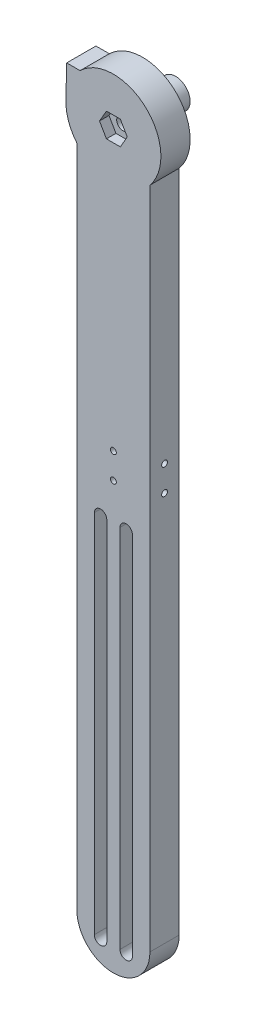
ISO-10303-21;
HEADER;
FILE_DESCRIPTION(('STEP AP214'),'2;1');
FILE_NAME('part.step','',(''),(''),'','','');
FILE_SCHEMA(('AUTOMOTIVE_DESIGN { 1 0 10303 214 1 1 1 1 }'));
ENDSEC;
DATA;
#1=APPLICATION_CONTEXT('core data for automotive mechanical design processes');
#2=APPLICATION_PROTOCOL_DEFINITION('international standard','automotive_design',2000,#1);
#3=PRODUCT_CONTEXT('',#1,'mechanical');
#4=PRODUCT('Part','Part','',(#3));
#5=PRODUCT_RELATED_PRODUCT_CATEGORY('part','',(#4));
#6=PRODUCT_DEFINITION_FORMATION('','',#4);
#7=PRODUCT_DEFINITION_CONTEXT('part definition',#1,'design');
#8=PRODUCT_DEFINITION('design','',#6,#7);
#9=PRODUCT_DEFINITION_SHAPE('','',#8);
#10=(LENGTH_UNIT() NAMED_UNIT(*) SI_UNIT(.MILLI.,.METRE.));
#11=(NAMED_UNIT(*) PLANE_ANGLE_UNIT() SI_UNIT($,.RADIAN.));
#12=(NAMED_UNIT(*) SI_UNIT($,.STERADIAN.) SOLID_ANGLE_UNIT());
#13=UNCERTAINTY_MEASURE_WITH_UNIT(LENGTH_MEASURE(1.E-05),#10,'distance_accuracy_value','');
#14=(GEOMETRIC_REPRESENTATION_CONTEXT(3) GLOBAL_UNCERTAINTY_ASSIGNED_CONTEXT((#13)) GLOBAL_UNIT_ASSIGNED_CONTEXT((#10,
#11,#12)) REPRESENTATION_CONTEXT('',''));
#15=CARTESIAN_POINT('',(0.,0.,0.));
#16=DIRECTION('',(0.,0.,1.));
#17=DIRECTION('',(1.,0.,0.));
#18=AXIS2_PLACEMENT_3D('',#15,#16,#17);
#19=CARTESIAN_POINT('',(0.,-99.9999999999999,8.));
#20=DIRECTION('',(0.,0.,-1.));
#21=DIRECTION('',(1.,0.,0.));
#22=AXIS2_PLACEMENT_3D('',#19,#20,#21);
#23=CYLINDRICAL_SURFACE('',#22,13.);
#24=CARTESIAN_POINT('',(0.,-99.9999999999999,0.));
#25=DIRECTION('',(0.,0.,-1.));
#26=DIRECTION('',(1.,0.,0.));
#27=AXIS2_PLACEMENT_3D('',#24,#25,#26);
#28=CIRCLE('',#27,13.);
#29=CARTESIAN_POINT('',(-9.11004153380745,-90.7259963741486,0.));
#30=VERTEX_POINT('',#29);
#31=CARTESIAN_POINT('',(10.0000000000001,-108.306623862918,0.));
#32=VERTEX_POINT('',#31);
#33=EDGE_CURVE('E528',#30,#32,#28,.T.);
#34=ORIENTED_EDGE('',*,*,#33,.F.);
#35=DIRECTION('',(0.,0.,-1.));
#36=VECTOR('',#35,1.);
#37=CARTESIAN_POINT('',(-9.11004153380744,-90.7259963741486,7.99999999999998));
#38=LINE('',#37,#36);
#39=CARTESIAN_POINT('',(-9.11004153380743,-90.7259963741486,8.));
#40=VERTEX_POINT('',#39);
#41=EDGE_CURVE('E235',#30,#40,#38,.F.);
#42=ORIENTED_EDGE('',*,*,#41,.T.);
#43=CARTESIAN_POINT('',(0.,-99.9999999999999,8.));
#44=DIRECTION('',(0.,0.,-1.));
#45=DIRECTION('',(1.,0.,0.));
#46=AXIS2_PLACEMENT_3D('',#43,#44,#45);
#47=CIRCLE('',#46,13.);
#48=CARTESIAN_POINT('',(10.0000000000001,-108.306623862918,8.));
#49=VERTEX_POINT('',#48);
#50=EDGE_CURVE('E533',#40,#49,#47,.T.);
#51=ORIENTED_EDGE('',*,*,#50,.T.);
#52=DIRECTION('',(0.,0.,-1.));
#53=VECTOR('',#52,1.);
#54=CARTESIAN_POINT('',(10.0000000000001,-108.306623862918,8.));
#55=LINE('',#54,#53);
#56=EDGE_CURVE('E499',#49,#32,#55,.T.);
#57=ORIENTED_EDGE('',*,*,#56,.T.);
#58=EDGE_LOOP('',(#34,#42,#51,#57));
#59=FACE_BOUND('',#58,.T.);
#60=ADVANCED_FACE('F54',(#59),#23,.T.);
#61=CARTESIAN_POINT('',(-9.99999999999992,-108.306623862918,8.));
#62=VERTEX_POINT('',#61);
#63=CARTESIAN_POINT('',(-12.9909985797308,-99.5163101185333,8.00000000000001));
#64=VERTEX_POINT('',#63);
#65=EDGE_CURVE('E527',#62,#64,#47,.T.);
#66=ORIENTED_EDGE('',*,*,#65,.T.);
#67=DIRECTION('',(0.,0.,-1.));
#68=VECTOR('',#67,1.);
#69=CARTESIAN_POINT('',(-12.9909985797307,-99.5163101185333,8.));
#70=LINE('',#69,#68);
#71=CARTESIAN_POINT('',(-12.9909985797307,-99.5163101185333,0.));
#72=VERTEX_POINT('',#71);
#73=EDGE_CURVE('E269',#64,#72,#70,.T.);
#74=ORIENTED_EDGE('',*,*,#73,.T.);
#75=CARTESIAN_POINT('',(-9.99999999999992,-108.306623862918,0.));
#76=VERTEX_POINT('',#75);
#77=EDGE_CURVE('E535',#76,#72,#28,.T.);
#78=ORIENTED_EDGE('',*,*,#77,.F.);
#79=DIRECTION('',(0.,0.,-1.));
#80=VECTOR('',#79,1.);
#81=CARTESIAN_POINT('',(-9.99999999999992,-108.306623862918,8.));
#82=LINE('',#81,#80);
#83=EDGE_CURVE('E510',#76,#62,#82,.F.);
#84=ORIENTED_EDGE('',*,*,#83,.T.);
#85=EDGE_LOOP('',(#66,#74,#78,#84));
#86=FACE_BOUND('',#85,.T.);
#87=ADVANCED_FACE('F554',(#86),#23,.T.);
#88=CARTESIAN_POINT('',(0.,-99.9999999999999,-13.));
#89=DIRECTION('',(0.,0.,-1.));
#90=DIRECTION('',(1.,0.,0.));
#91=AXIS2_PLACEMENT_3D('',#88,#89,#90);
#92=CYLINDRICAL_SURFACE('',#91,1.69999999999999);
#93=CARTESIAN_POINT('',(0.,-99.9999999999999,-9.));
#94=DIRECTION('',(0.,0.,1.));
#95=DIRECTION('',(-1.,0.,0.));
#96=AXIS2_PLACEMENT_3D('',#93,#94,#95);
#97=CIRCLE('',#96,1.69999999999999);
#98=CARTESIAN_POINT('',(-1.69999999999996,-99.9999999999999,-9.));
#99=VERTEX_POINT('',#98);
#100=EDGE_CURVE('E519',#99,#99,#97,.T.);
#101=ORIENTED_EDGE('',*,*,#100,.F.);
#102=EDGE_LOOP('',(#101));
#103=FACE_BOUND('',#102,.T.);
#104=CARTESIAN_POINT('',(0.,-99.9999999999999,5.4));
#105=DIRECTION('',(0.,0.,1.));
#106=DIRECTION('',(-1.,0.,0.));
#107=AXIS2_PLACEMENT_3D('',#104,#105,#106);
#108=CIRCLE('',#107,1.69999999999999);
#109=CARTESIAN_POINT('',(-1.69999999999996,-99.9999999999999,5.4));
#110=VERTEX_POINT('',#109);
#111=EDGE_CURVE('E56',#110,#110,#108,.F.);
#112=ORIENTED_EDGE('',*,*,#111,.F.);
#113=EDGE_LOOP('',(#112));
#114=FACE_BOUND('',#113,.T.);
#115=ADVANCED_FACE('F549',(#103,#114),#92,.F.);
#116=CARTESIAN_POINT('',(0.,-99.9999999999999,0.));
#117=DIRECTION('',(0.,0.,-1.));
#118=DIRECTION('',(1.,0.,0.));
#119=AXIS2_PLACEMENT_3D('',#116,#117,#118);
#120=CYLINDRICAL_SURFACE('',#119,4.00000000000001);
#121=CARTESIAN_POINT('',(0.,-99.9999999999999,-9.));
#122=DIRECTION('',(0.,0.,1.));
#123=DIRECTION('',(-1.,0.,0.));
#124=AXIS2_PLACEMENT_3D('',#121,#122,#123);
#125=CIRCLE('',#124,4.00000000000001);
#126=CARTESIAN_POINT('',(-3.99999999999998,-99.9999999999999,-9.));
#127=VERTEX_POINT('',#126);
#128=EDGE_CURVE('E63',#127,#127,#125,.T.);
#129=ORIENTED_EDGE('',*,*,#128,.T.);
#130=EDGE_LOOP('',(#129));
#131=FACE_BOUND('',#130,.T.);
#132=CARTESIAN_POINT('',(0.,-99.9999999999999,-2.));
#133=DIRECTION('',(0.,0.,1.));
#134=DIRECTION('',(-1.,0.,0.));
#135=AXIS2_PLACEMENT_3D('',#132,#133,#134);
#136=CIRCLE('',#135,4.00000000000001);
#137=CARTESIAN_POINT('',(-3.99999999999998,-99.9999999999999,-2.));
#138=VERTEX_POINT('',#137);
#139=EDGE_CURVE('E11',#138,#138,#136,.T.);
#140=ORIENTED_EDGE('',*,*,#139,.F.);
#141=EDGE_LOOP('',(#140));
#142=FACE_BOUND('',#141,.T.);
#143=ADVANCED_FACE('F60',(#131,#142),#120,.T.);
#144=CARTESIAN_POINT('',(0.,-99.9999999999999,-9.));
#145=DIRECTION('',(0.,0.,1.));
#146=DIRECTION('',(-1.,0.,0.));
#147=AXIS2_PLACEMENT_3D('',#144,#145,#146);
#148=PLANE('',#147);
#149=ORIENTED_EDGE('',*,*,#100,.T.);
#150=EDGE_LOOP('',(#149));
#151=FACE_BOUND('',#150,.T.);
#152=ORIENTED_EDGE('',*,*,#128,.F.);
#153=EDGE_LOOP('',(#152));
#154=FACE_BOUND('',#153,.T.);
#155=ADVANCED_FACE('F541',(#151,#154),#148,.F.);
#156=CARTESIAN_POINT('',(0.,-99.9999999999999,8.));
#157=DIRECTION('',(0.,0.,-1.));
#158=DIRECTION('',(1.,0.,0.));
#159=AXIS2_PLACEMENT_3D('',#156,#157,#158);
#160=PLANE('',#159);
#161=ORIENTED_EDGE('',*,*,#50,.F.);
#162=DIRECTION('',(-1.,0.,0.));
#163=VECTOR('',#162,1.);
#164=CARTESIAN_POINT('',(13.002,-90.7259963741484,8.00000000000001));
#165=LINE('',#164,#163);
#166=CARTESIAN_POINT('',(-12.7746204756805,-90.7259963741486,8.));
#167=VERTEX_POINT('',#166);
#168=EDGE_CURVE('E237',#40,#167,#165,.T.);
#169=ORIENTED_EDGE('',*,*,#168,.T.);
#170=DIRECTION('',(0.0247233375920062,0.999694331572562,0.));
#171=VECTOR('',#170,1.);
#172=CARTESIAN_POINT('',(-12.7819530757289,-91.022491888832,8.));
#173=LINE('',#172,#171);
#174=CARTESIAN_POINT('',(-12.9920128198986,-99.5163101185333,8.00000000000001));
#175=VERTEX_POINT('',#174);
#176=EDGE_CURVE('E248',#175,#167,#173,.T.);
#177=ORIENTED_EDGE('',*,*,#176,.F.);
#178=DIRECTION('',(1.,0.,0.));
#179=VECTOR('',#178,1.);
#180=CARTESIAN_POINT('',(-24.77082327833,-99.5163101185334,8.00000000000001));
#181=LINE('',#180,#179);
#182=EDGE_CURVE('E250',#175,#64,#181,.T.);
#183=ORIENTED_EDGE('',*,*,#182,.T.);
#184=ORIENTED_EDGE('',*,*,#65,.F.);
#185=DIRECTION('',(0.,-1.,0.));
#186=VECTOR('',#185,1.);
#187=CARTESIAN_POINT('',(-10.0000000000001,-86.9979999999999,8.));
#188=LINE('',#187,#186);
#189=CARTESIAN_POINT('',(-9.99999999999867,-290.,8.));
#190=VERTEX_POINT('',#189);
#191=EDGE_CURVE('E508',#62,#190,#188,.T.);
#192=ORIENTED_EDGE('',*,*,#191,.T.);
#193=CARTESIAN_POINT('',(1.32879818259823E-12,-290.,8.));
#194=DIRECTION('',(0.,0.,1.));
#195=DIRECTION('',(-1.,0.,0.));
#196=AXIS2_PLACEMENT_3D('',#193,#194,#195);
#197=CIRCLE('',#196,10.);
#198=CARTESIAN_POINT('',(1.24553145575135E-12,-300.,8.));
#199=VERTEX_POINT('',#198);
#200=EDGE_CURVE('E482',#190,#199,#197,.T.);
#201=ORIENTED_EDGE('',*,*,#200,.T.);
#202=CARTESIAN_POINT('',(1.31492039479042E-12,-290.,8.));
#203=DIRECTION('',(0.,0.,1.));
#204=DIRECTION('',(-1.,0.,0.));
#205=AXIS2_PLACEMENT_3D('',#202,#203,#204);
#206=CIRCLE('',#205,10.);
#207=CARTESIAN_POINT('',(10.0000000000013,-290.,8.));
#208=VERTEX_POINT('',#207);
#209=EDGE_CURVE('E484',#199,#208,#206,.T.);
#210=ORIENTED_EDGE('',*,*,#209,.T.);
#211=DIRECTION('',(0.,-1.,0.));
#212=VECTOR('',#211,1.);
#213=CARTESIAN_POINT('',(9.99999999999994,-86.9979999999998,8.));
#214=LINE('',#213,#212);
#215=EDGE_CURVE('E497',#49,#208,#214,.T.);
#216=ORIENTED_EDGE('',*,*,#215,.F.);
#217=EDGE_LOOP('',(#161,#169,#177,#183,#184,#192,#201,#210,#216));
#218=FACE_BOUND('',#217,.T.);
#219=CARTESIAN_POINT('',(3.50000000000138,-293.5,8.));
#220=DIRECTION('',(0.,0.,1.));
#221=DIRECTION('',(-1.,0.,0.));
#222=AXIS2_PLACEMENT_3D('',#219,#220,#221);
#223=CIRCLE('',#222,1.70000000000003);
#224=CARTESIAN_POINT('',(1.80000000000134,-293.5,8.));
#225=VERTEX_POINT('',#224);
#226=CARTESIAN_POINT('',(5.20000000000141,-293.5,8.));
#227=VERTEX_POINT('',#226);
#228=EDGE_CURVE('E401',#225,#227,#223,.T.);
#229=ORIENTED_EDGE('',*,*,#228,.F.);
#230=DIRECTION('',(0.,-1.,0.));
#231=VECTOR('',#230,1.);
#232=CARTESIAN_POINT('',(1.8000000000007,-200.,8.));
#233=LINE('',#232,#231);
#234=CARTESIAN_POINT('',(1.80000000000065,-193.5,8.));
#235=VERTEX_POINT('',#234);
#236=EDGE_CURVE('E404',#235,#225,#233,.T.);
#237=ORIENTED_EDGE('',*,*,#236,.F.);
#238=CARTESIAN_POINT('',(3.50000000000067,-193.5,8.));
#239=DIRECTION('',(0.,0.,1.));
#240=DIRECTION('',(-1.,0.,0.));
#241=AXIS2_PLACEMENT_3D('',#238,#239,#240);
#242=CIRCLE('',#241,1.70000000000002);
#243=CARTESIAN_POINT('',(5.2000000000007,-193.5,8.));
#244=VERTEX_POINT('',#243);
#245=EDGE_CURVE('E407',#244,#235,#242,.T.);
#246=ORIENTED_EDGE('',*,*,#245,.F.);
#247=DIRECTION('',(0.,-1.,0.));
#248=VECTOR('',#247,1.);
#249=CARTESIAN_POINT('',(5.20000000000074,-200.,8.));
#250=LINE('',#249,#248);
#251=EDGE_CURVE('E412',#244,#227,#250,.T.);
#252=ORIENTED_EDGE('',*,*,#251,.T.);
#253=EDGE_LOOP('',(#229,#237,#246,#252));
#254=FACE_BOUND('',#253,.T.);
#255=CARTESIAN_POINT('',(-3.49999999999863,-293.5,8.));
#256=DIRECTION('',(0.,0.,1.));
#257=DIRECTION('',(-1.,0.,0.));
#258=AXIS2_PLACEMENT_3D('',#255,#256,#257);
#259=CIRCLE('',#258,1.70000000000004);
#260=CARTESIAN_POINT('',(-5.19999999999867,-293.5,8.));
#261=VERTEX_POINT('',#260);
#262=CARTESIAN_POINT('',(-1.79999999999861,-293.5,8.));
#263=VERTEX_POINT('',#262);
#264=EDGE_CURVE('E383',#261,#263,#259,.T.);
#265=ORIENTED_EDGE('',*,*,#264,.F.);
#266=DIRECTION('',(0.,-1.,0.));
#267=VECTOR('',#266,1.);
#268=CARTESIAN_POINT('',(-5.19999999999931,-200.,8.));
#269=LINE('',#268,#267);
#270=CARTESIAN_POINT('',(-5.19999999999936,-193.5,8.));
#271=VERTEX_POINT('',#270);
#272=EDGE_CURVE('E386',#271,#261,#269,.T.);
#273=ORIENTED_EDGE('',*,*,#272,.F.);
#274=CARTESIAN_POINT('',(-3.49999999999931,-193.5,8.));
#275=DIRECTION('',(0.,0.,1.));
#276=DIRECTION('',(-1.,0.,0.));
#277=AXIS2_PLACEMENT_3D('',#274,#275,#276);
#278=CIRCLE('',#277,1.70000000000003);
#279=CARTESIAN_POINT('',(-1.7999999999993,-193.5,8.));
#280=VERTEX_POINT('',#279);
#281=EDGE_CURVE('E395',#280,#271,#278,.T.);
#282=ORIENTED_EDGE('',*,*,#281,.F.);
#283=DIRECTION('',(0.,-1.,0.));
#284=VECTOR('',#283,1.);
#285=CARTESIAN_POINT('',(-1.79999999999925,-200.,8.));
#286=LINE('',#285,#284);
#287=EDGE_CURVE('E396',#280,#263,#286,.T.);
#288=ORIENTED_EDGE('',*,*,#287,.T.);
#289=EDGE_LOOP('',(#265,#273,#282,#288));
#290=FACE_BOUND('',#289,.T.);
#291=CARTESIAN_POINT('',(5.58580959264532E-13,-176.3,8.));
#292=DIRECTION('',(0.,0.,1.));
#293=DIRECTION('',(-1.,0.,0.));
#294=AXIS2_PLACEMENT_3D('',#291,#292,#293);
#295=CIRCLE('',#294,0.799999999999999);
#296=CARTESIAN_POINT('',(-0.79999999999944,-176.3,8.));
#297=VERTEX_POINT('',#296);
#298=EDGE_CURVE('E378',#297,#297,#295,.T.);
#299=ORIENTED_EDGE('',*,*,#298,.F.);
#300=EDGE_LOOP('',(#299));
#301=FACE_BOUND('',#300,.T.);
#302=CARTESIAN_POINT('',(6.07153216591882E-13,-183.3,8.));
#303=DIRECTION('',(0.,0.,1.));
#304=DIRECTION('',(-1.,0.,0.));
#305=AXIS2_PLACEMENT_3D('',#302,#303,#304);
#306=CIRCLE('',#305,0.799999999999999);
#307=CARTESIAN_POINT('',(-0.799999999999392,-183.3,8.));
#308=VERTEX_POINT('',#307);
#309=EDGE_CURVE('E377',#308,#308,#306,.T.);
#310=ORIENTED_EDGE('',*,*,#309,.F.);
#311=EDGE_LOOP('',(#310));
#312=FACE_BOUND('',#311,.T.);
#313=DIRECTION('',(0.500000000000006,-0.866025403784435,0.));
#314=VECTOR('',#313,1.);
#315=CARTESIAN_POINT('',(-3.79896477126771,-99.9999999999999,8.));
#316=LINE('',#315,#314);
#317=CARTESIAN_POINT('',(-3.79896477126772,-99.9999999999999,8.));
#318=VERTEX_POINT('',#317);
#319=CARTESIAN_POINT('',(-1.89948238563382,-103.29,8.));
#320=VERTEX_POINT('',#319);
#321=EDGE_CURVE('E303',#318,#320,#316,.T.);
#322=ORIENTED_EDGE('',*,*,#321,.F.);
#323=DIRECTION('',(-0.499999999999993,-0.866025403784442,0.));
#324=VECTOR('',#323,1.);
#325=CARTESIAN_POINT('',(-1.89948238563387,-96.7099999999999,8.));
#326=LINE('',#325,#324);
#327=CARTESIAN_POINT('',(-1.89948238563387,-96.7099999999999,8.));
#328=VERTEX_POINT('',#327);
#329=EDGE_CURVE('E83',#328,#318,#326,.T.);
#330=ORIENTED_EDGE('',*,*,#329,.F.);
#331=DIRECTION('',(-1.,0.,0.));
#332=VECTOR('',#331,1.);
#333=CARTESIAN_POINT('',(1.8994823856339,-96.7099999999998,8.));
#334=LINE('',#333,#332);
#335=CARTESIAN_POINT('',(1.8994823856339,-96.7099999999998,8.));
#336=VERTEX_POINT('',#335);
#337=EDGE_CURVE('E277',#336,#328,#334,.T.);
#338=ORIENTED_EDGE('',*,*,#337,.F.);
#339=DIRECTION('',(-0.500000000000006,0.866025403784435,0.));
#340=VECTOR('',#339,1.);
#341=CARTESIAN_POINT('',(3.79896477126779,-99.9999999999998,8.));
#342=LINE('',#341,#340);
#343=CARTESIAN_POINT('',(3.79896477126779,-99.9999999999998,8.));
#344=VERTEX_POINT('',#343);
#345=EDGE_CURVE('E315',#344,#336,#342,.T.);
#346=ORIENTED_EDGE('',*,*,#345,.F.);
#347=DIRECTION('',(0.499999999999994,0.866025403784442,0.));
#348=VECTOR('',#347,1.);
#349=CARTESIAN_POINT('',(1.89948238563393,-103.29,8.));
#350=LINE('',#349,#348);
#351=CARTESIAN_POINT('',(1.89948238563393,-103.29,8.));
#352=VERTEX_POINT('',#351);
#353=EDGE_CURVE('E306',#352,#344,#350,.T.);
#354=ORIENTED_EDGE('',*,*,#353,.F.);
#355=DIRECTION('',(1.,0.,0.));
#356=VECTOR('',#355,1.);
#357=CARTESIAN_POINT('',(-1.89948238563382,-103.29,8.));
#358=LINE('',#357,#356);
#359=EDGE_CURVE('E304',#320,#352,#358,.T.);
#360=ORIENTED_EDGE('',*,*,#359,.F.);
#361=EDGE_LOOP('',(#322,#330,#338,#346,#354,#360));
#362=FACE_BOUND('',#361,.T.);
#363=ADVANCED_FACE('F543',(#218,#254,#290,#301,#312,#362),#160,.F.);
#364=CARTESIAN_POINT('',(0.,-99.9999999999999,0.));
#365=DIRECTION('',(0.,0.,-1.));
#366=DIRECTION('',(1.,0.,0.));
#367=AXIS2_PLACEMENT_3D('',#364,#365,#366);
#368=PLANE('',#367);
#369=DIRECTION('',(-1.,0.,0.));
#370=VECTOR('',#369,1.);
#371=CARTESIAN_POINT('',(13.002,-90.7259963741484,0.));
#372=LINE('',#371,#370);
#373=CARTESIAN_POINT('',(-12.7746204756805,-90.7259963741486,0.));
#374=VERTEX_POINT('',#373);
#375=EDGE_CURVE('E224',#30,#374,#372,.T.);
#376=ORIENTED_EDGE('',*,*,#375,.F.);
#377=ORIENTED_EDGE('',*,*,#33,.T.);
#378=DIRECTION('',(0.,-1.,0.));
#379=VECTOR('',#378,1.);
#380=CARTESIAN_POINT('',(9.99999999999994,-86.9979999999998,0.));
#381=LINE('',#380,#379);
#382=CARTESIAN_POINT('',(10.0000000000013,-290.,0.));
#383=VERTEX_POINT('',#382);
#384=EDGE_CURVE('E496',#32,#383,#381,.T.);
#385=ORIENTED_EDGE('',*,*,#384,.T.);
#386=CARTESIAN_POINT('',(1.31492039479042E-12,-290.,0.));
#387=DIRECTION('',(0.,0.,1.));
#388=DIRECTION('',(-1.,0.,0.));
#389=AXIS2_PLACEMENT_3D('',#386,#387,#388);
#390=CIRCLE('',#389,10.);
#391=CARTESIAN_POINT('',(1.24553145575135E-12,-300.,0.));
#392=VERTEX_POINT('',#391);
#393=EDGE_CURVE('E476',#383,#392,#390,.F.);
#394=ORIENTED_EDGE('',*,*,#393,.T.);
#395=CARTESIAN_POINT('',(1.32879818259823E-12,-290.,0.));
#396=DIRECTION('',(0.,0.,1.));
#397=DIRECTION('',(-1.,0.,0.));
#398=AXIS2_PLACEMENT_3D('',#395,#396,#397);
#399=CIRCLE('',#398,10.);
#400=CARTESIAN_POINT('',(-9.99999999999867,-290.,0.));
#401=VERTEX_POINT('',#400);
#402=EDGE_CURVE('E473',#392,#401,#399,.F.);
#403=ORIENTED_EDGE('',*,*,#402,.T.);
#404=DIRECTION('',(0.,-1.,0.));
#405=VECTOR('',#404,1.);
#406=CARTESIAN_POINT('',(-10.0000000000001,-86.9979999999999,0.));
#407=LINE('',#406,#405);
#408=EDGE_CURVE('E493',#76,#401,#407,.T.);
#409=ORIENTED_EDGE('',*,*,#408,.F.);
#410=ORIENTED_EDGE('',*,*,#77,.T.);
#411=DIRECTION('',(1.,0.,0.));
#412=VECTOR('',#411,1.);
#413=CARTESIAN_POINT('',(-24.77082327833,-99.5163101185334,0.));
#414=LINE('',#413,#412);
#415=CARTESIAN_POINT('',(-12.9920128198986,-99.5163101185333,0.));
#416=VERTEX_POINT('',#415);
#417=EDGE_CURVE('E75',#416,#72,#414,.T.);
#418=ORIENTED_EDGE('',*,*,#417,.F.);
#419=DIRECTION('',(-0.0247233375920062,-0.999694331572562,0.));
#420=VECTOR('',#419,1.);
#421=CARTESIAN_POINT('',(-12.9992125403066,-99.8074326117659,0.));
#422=LINE('',#421,#420);
#423=EDGE_CURVE('E236',#374,#416,#422,.T.);
#424=ORIENTED_EDGE('',*,*,#423,.F.);
#425=EDGE_LOOP('',(#376,#377,#385,#394,#403,#409,#410,#418,#424));
#426=FACE_BOUND('',#425,.T.);
#427=CARTESIAN_POINT('',(0.,-99.9999999999999,0.));
#428=DIRECTION('',(0.,0.,-1.));
#429=DIRECTION('',(1.,0.,0.));
#430=AXIS2_PLACEMENT_3D('',#427,#428,#429);
#431=CIRCLE('',#430,5.00000000000001);
#432=CARTESIAN_POINT('',(5.00000000000003,-99.9999999999998,0.));
#433=VERTEX_POINT('',#432);
#434=EDGE_CURVE('E513',#433,#433,#431,.T.);
#435=ORIENTED_EDGE('',*,*,#434,.F.);
#436=EDGE_LOOP('',(#435));
#437=FACE_BOUND('',#436,.T.);
#438=CARTESIAN_POINT('',(3.50000000000138,-293.5,0.));
#439=DIRECTION('',(0.,0.,1.));
#440=DIRECTION('',(-1.,0.,0.));
#441=AXIS2_PLACEMENT_3D('',#438,#439,#440);
#442=CIRCLE('',#441,1.70000000000003);
#443=CARTESIAN_POINT('',(1.80000000000134,-293.5,0.));
#444=VERTEX_POINT('',#443);
#445=CARTESIAN_POINT('',(5.20000000000141,-293.5,0.));
#446=VERTEX_POINT('',#445);
#447=EDGE_CURVE('E435',#444,#446,#442,.T.);
#448=ORIENTED_EDGE('',*,*,#447,.T.);
#449=DIRECTION('',(0.,-1.,0.));
#450=VECTOR('',#449,1.);
#451=CARTESIAN_POINT('',(5.20000000000074,-200.,0.));
#452=LINE('',#451,#450);
#453=CARTESIAN_POINT('',(5.2000000000007,-193.5,0.));
#454=VERTEX_POINT('',#453);
#455=EDGE_CURVE('E388',#454,#446,#452,.T.);
#456=ORIENTED_EDGE('',*,*,#455,.F.);
#457=CARTESIAN_POINT('',(3.50000000000067,-193.5,0.));
#458=DIRECTION('',(0.,0.,1.));
#459=DIRECTION('',(-1.,0.,0.));
#460=AXIS2_PLACEMENT_3D('',#457,#458,#459);
#461=CIRCLE('',#460,1.70000000000002);
#462=CARTESIAN_POINT('',(1.80000000000065,-193.5,0.));
#463=VERTEX_POINT('',#462);
#464=EDGE_CURVE('E443',#454,#463,#461,.T.);
#465=ORIENTED_EDGE('',*,*,#464,.T.);
#466=DIRECTION('',(0.,-1.,0.));
#467=VECTOR('',#466,1.);
#468=CARTESIAN_POINT('',(1.8000000000007,-200.,0.));
#469=LINE('',#468,#467);
#470=EDGE_CURVE('E437',#463,#444,#469,.T.);
#471=ORIENTED_EDGE('',*,*,#470,.T.);
#472=EDGE_LOOP('',(#448,#456,#465,#471));
#473=FACE_BOUND('',#472,.T.);
#474=CARTESIAN_POINT('',(-3.49999999999863,-293.5,0.));
#475=DIRECTION('',(0.,0.,1.));
#476=DIRECTION('',(-1.,0.,0.));
#477=AXIS2_PLACEMENT_3D('',#474,#475,#476);
#478=CIRCLE('',#477,1.70000000000004);
#479=CARTESIAN_POINT('',(-5.19999999999867,-293.5,0.));
#480=VERTEX_POINT('',#479);
#481=CARTESIAN_POINT('',(-1.79999999999861,-293.5,0.));
#482=VERTEX_POINT('',#481);
#483=EDGE_CURVE('E420',#480,#482,#478,.T.);
#484=ORIENTED_EDGE('',*,*,#483,.T.);
#485=DIRECTION('',(0.,-1.,0.));
#486=VECTOR('',#485,1.);
#487=CARTESIAN_POINT('',(-1.79999999999925,-200.,0.));
#488=LINE('',#487,#486);
#489=CARTESIAN_POINT('',(-1.7999999999993,-193.5,0.));
#490=VERTEX_POINT('',#489);
#491=EDGE_CURVE('E429',#490,#482,#488,.T.);
#492=ORIENTED_EDGE('',*,*,#491,.F.);
#493=CARTESIAN_POINT('',(-3.49999999999931,-193.5,0.));
#494=DIRECTION('',(0.,0.,1.));
#495=DIRECTION('',(-1.,0.,0.));
#496=AXIS2_PLACEMENT_3D('',#493,#494,#495);
#497=CIRCLE('',#496,1.70000000000003);
#498=CARTESIAN_POINT('',(-5.19999999999936,-193.5,0.));
#499=VERTEX_POINT('',#498);
#500=EDGE_CURVE('E423',#490,#499,#497,.T.);
#501=ORIENTED_EDGE('',*,*,#500,.T.);
#502=DIRECTION('',(0.,-1.,0.));
#503=VECTOR('',#502,1.);
#504=CARTESIAN_POINT('',(-5.19999999999931,-200.,0.));
#505=LINE('',#504,#503);
#506=EDGE_CURVE('E422',#499,#480,#505,.T.);
#507=ORIENTED_EDGE('',*,*,#506,.T.);
#508=EDGE_LOOP('',(#484,#492,#501,#507));
#509=FACE_BOUND('',#508,.T.);
#510=CARTESIAN_POINT('',(5.58580959264532E-13,-176.3,0.));
#511=DIRECTION('',(0.,0.,-1.));
#512=DIRECTION('',(1.,0.,0.));
#513=AXIS2_PLACEMENT_3D('',#510,#511,#512);
#514=CIRCLE('',#513,0.799999999999999);
#515=CARTESIAN_POINT('',(0.800000000000558,-176.3,0.));
#516=VERTEX_POINT('',#515);
#517=EDGE_CURVE('E338',#516,#516,#514,.T.);
#518=ORIENTED_EDGE('',*,*,#517,.F.);
#519=EDGE_LOOP('',(#518));
#520=FACE_BOUND('',#519,.T.);
#521=CARTESIAN_POINT('',(6.07153216591882E-13,-183.3,0.));
#522=DIRECTION('',(0.,0.,-1.));
#523=DIRECTION('',(1.,0.,0.));
#524=AXIS2_PLACEMENT_3D('',#521,#522,#523);
#525=CIRCLE('',#524,0.799999999999999);
#526=CARTESIAN_POINT('',(0.800000000000606,-183.3,0.));
#527=VERTEX_POINT('',#526);
#528=EDGE_CURVE('E337',#527,#527,#525,.T.);
#529=ORIENTED_EDGE('',*,*,#528,.F.);
#530=EDGE_LOOP('',(#529));
#531=FACE_BOUND('',#530,.T.);
#532=ADVANCED_FACE('F238',(#426,#437,#473,#509,#520,#531),#368,.T.);
#533=CARTESIAN_POINT('',(0.,-99.9999999999999,-2.));
#534=DIRECTION('',(0.,0.,1.));
#535=DIRECTION('',(-1.,0.,0.));
#536=AXIS2_PLACEMENT_3D('',#533,#534,#535);
#537=PLANE('',#536);
#538=CARTESIAN_POINT('',(0.,-99.9999999999999,-2.));
#539=DIRECTION('',(0.,0.,1.));
#540=DIRECTION('',(-1.,0.,0.));
#541=AXIS2_PLACEMENT_3D('',#538,#539,#540);
#542=CIRCLE('',#541,5.00000000000001);
#543=CARTESIAN_POINT('',(-4.99999999999998,-99.9999999999999,-2.));
#544=VERTEX_POINT('',#543);
#545=EDGE_CURVE('E502',#544,#544,#542,.T.);
#546=ORIENTED_EDGE('',*,*,#545,.F.);
#547=EDGE_LOOP('',(#546));
#548=FACE_BOUND('',#547,.T.);
#549=ORIENTED_EDGE('',*,*,#139,.T.);
#550=EDGE_LOOP('',(#549));
#551=FACE_BOUND('',#550,.T.);
#552=ADVANCED_FACE('F558',(#548,#551),#537,.F.);
#553=CARTESIAN_POINT('',(0.,-99.9999999999999,-16.142135623731));
#554=DIRECTION('',(0.,0.,1.));
#555=DIRECTION('',(-1.,0.,0.));
#556=AXIS2_PLACEMENT_3D('',#553,#554,#555);
#557=CYLINDRICAL_SURFACE('',#556,5.00000000000001);
#558=ORIENTED_EDGE('',*,*,#545,.T.);
#559=EDGE_LOOP('',(#558));
#560=FACE_BOUND('',#559,.T.);
#561=ORIENTED_EDGE('',*,*,#434,.T.);
#562=EDGE_LOOP('',(#561));
#563=FACE_BOUND('',#562,.T.);
#564=ADVANCED_FACE('F569',(#560,#563),#557,.T.);
#565=CARTESIAN_POINT('',(-10.0000000000001,-86.9979999999999,8.));
#566=DIRECTION('',(-1.,0.,0.));
#567=DIRECTION('',(0.,0.,-1.));
#568=AXIS2_PLACEMENT_3D('',#565,#566,#567);
#569=PLANE('',#568);
#570=ORIENTED_EDGE('',*,*,#83,.F.);
#571=ORIENTED_EDGE('',*,*,#408,.T.);
#572=DIRECTION('',(0.,0.,-1.));
#573=VECTOR('',#572,1.);
#574=CARTESIAN_POINT('',(-9.99999999999867,-290.,8.));
#575=LINE('',#574,#573);
#576=EDGE_CURVE('E489',#401,#190,#575,.F.);
#577=ORIENTED_EDGE('',*,*,#576,.T.);
#578=ORIENTED_EDGE('',*,*,#191,.F.);
#579=EDGE_LOOP('',(#570,#571,#577,#578));
#580=FACE_BOUND('',#579,.T.);
#581=CARTESIAN_POINT('',(-9.99999999999939,-183.3,4.));
#582=DIRECTION('',(-1.,0.,0.));
#583=DIRECTION('',(0.,0.,-1.));
#584=AXIS2_PLACEMENT_3D('',#581,#582,#583);
#585=CIRCLE('',#584,0.799999999999988);
#586=CARTESIAN_POINT('',(-9.99999999999939,-183.3,3.20000000000001));
#587=VERTEX_POINT('',#586);
#588=EDGE_CURVE('E341',#587,#587,#585,.T.);
#589=ORIENTED_EDGE('',*,*,#588,.F.);
#590=EDGE_LOOP('',(#589));
#591=FACE_BOUND('',#590,.T.);
#592=CARTESIAN_POINT('',(-9.99999999999943,-176.3,4.));
#593=DIRECTION('',(-1.,0.,0.));
#594=DIRECTION('',(0.,0.,-1.));
#595=AXIS2_PLACEMENT_3D('',#592,#593,#594);
#596=CIRCLE('',#595,0.799999999999988);
#597=CARTESIAN_POINT('',(-9.99999999999943,-176.3,3.20000000000001));
#598=VERTEX_POINT('',#597);
#599=EDGE_CURVE('E355',#598,#598,#596,.T.);
#600=ORIENTED_EDGE('',*,*,#599,.F.);
#601=EDGE_LOOP('',(#600));
#602=FACE_BOUND('',#601,.T.);
#603=ADVANCED_FACE('F573',(#580,#591,#602),#569,.T.);
#604=CARTESIAN_POINT('',(9.99999999999994,-86.9979999999998,0.));
#605=DIRECTION('',(1.,0.,0.));
#606=DIRECTION('',(0.,0.,1.));
#607=AXIS2_PLACEMENT_3D('',#604,#605,#606);
#608=PLANE('',#607);
#609=ORIENTED_EDGE('',*,*,#56,.F.);
#610=ORIENTED_EDGE('',*,*,#215,.T.);
#611=DIRECTION('',(0.,0.,-1.));
#612=VECTOR('',#611,1.);
#613=CARTESIAN_POINT('',(10.0000000000013,-290.,8.));
#614=LINE('',#613,#612);
#615=EDGE_CURVE('E462',#208,#383,#614,.T.);
#616=ORIENTED_EDGE('',*,*,#615,.T.);
#617=ORIENTED_EDGE('',*,*,#384,.F.);
#618=EDGE_LOOP('',(#609,#610,#616,#617));
#619=FACE_BOUND('',#618,.T.);
#620=CARTESIAN_POINT('',(10.0000000000006,-183.3,4.));
#621=DIRECTION('',(1.,0.,0.));
#622=DIRECTION('',(0.,0.,1.));
#623=AXIS2_PLACEMENT_3D('',#620,#621,#622);
#624=CIRCLE('',#623,0.799999999999988);
#625=CARTESIAN_POINT('',(10.0000000000006,-183.3,4.79999999999999));
#626=VERTEX_POINT('',#625);
#627=EDGE_CURVE('E359',#626,#626,#624,.T.);
#628=ORIENTED_EDGE('',*,*,#627,.F.);
#629=EDGE_LOOP('',(#628));
#630=FACE_BOUND('',#629,.T.);
#631=CARTESIAN_POINT('',(10.0000000000005,-176.3,4.));
#632=DIRECTION('',(1.,0.,0.));
#633=DIRECTION('',(0.,0.,1.));
#634=AXIS2_PLACEMENT_3D('',#631,#632,#633);
#635=CIRCLE('',#634,0.799999999999988);
#636=CARTESIAN_POINT('',(10.0000000000005,-176.3,4.79999999999999));
#637=VERTEX_POINT('',#636);
#638=EDGE_CURVE('E367',#637,#637,#635,.T.);
#639=ORIENTED_EDGE('',*,*,#638,.F.);
#640=EDGE_LOOP('',(#639));
#641=FACE_BOUND('',#640,.T.);
#642=ADVANCED_FACE('F574',(#619,#630,#641),#608,.T.);
#643=CARTESIAN_POINT('',(3.50000000000138,-293.5,8.));
#644=DIRECTION('',(0.,0.,-1.));
#645=DIRECTION('',(1.,0.,0.));
#646=AXIS2_PLACEMENT_3D('',#643,#644,#645);
#647=CYLINDRICAL_SURFACE('',#646,1.70000000000003);
#648=ORIENTED_EDGE('',*,*,#447,.F.);
#649=DIRECTION('',(0.,0.,-1.));
#650=VECTOR('',#649,1.);
#651=CARTESIAN_POINT('',(1.80000000000134,-293.5,8.));
#652=LINE('',#651,#650);
#653=EDGE_CURVE('E457',#225,#444,#652,.T.);
#654=ORIENTED_EDGE('',*,*,#653,.F.);
#655=ORIENTED_EDGE('',*,*,#228,.T.);
#656=DIRECTION('',(0.,0.,-1.));
#657=VECTOR('',#656,1.);
#658=CARTESIAN_POINT('',(5.20000000000141,-293.5,8.));
#659=LINE('',#658,#657);
#660=EDGE_CURVE('E448',#227,#446,#659,.T.);
#661=ORIENTED_EDGE('',*,*,#660,.T.);
#662=EDGE_LOOP('',(#648,#654,#655,#661));
#663=FACE_BOUND('',#662,.T.);
#664=ADVANCED_FACE('F579',(#663),#647,.F.);
#665=CARTESIAN_POINT('',(1.8000000000007,-200.,8.));
#666=DIRECTION('',(1.,0.,0.));
#667=DIRECTION('',(0.,1.,0.));
#668=AXIS2_PLACEMENT_3D('',#665,#666,#667);
#669=PLANE('',#668);
#670=ORIENTED_EDGE('',*,*,#470,.F.);
#671=DIRECTION('',(0.,0.,-1.));
#672=VECTOR('',#671,1.);
#673=CARTESIAN_POINT('',(1.80000000000065,-193.5,8.));
#674=LINE('',#673,#672);
#675=EDGE_CURVE('E454',#235,#463,#674,.T.);
#676=ORIENTED_EDGE('',*,*,#675,.F.);
#677=ORIENTED_EDGE('',*,*,#236,.T.);
#678=ORIENTED_EDGE('',*,*,#653,.T.);
#679=EDGE_LOOP('',(#670,#676,#677,#678));
#680=FACE_BOUND('',#679,.T.);
#681=ADVANCED_FACE('F608',(#680),#669,.T.);
#682=CARTESIAN_POINT('',(3.50000000000067,-193.5,8.));
#683=DIRECTION('',(0.,0.,-1.));
#684=DIRECTION('',(1.,0.,0.));
#685=AXIS2_PLACEMENT_3D('',#682,#683,#684);
#686=CYLINDRICAL_SURFACE('',#685,1.70000000000002);
#687=ORIENTED_EDGE('',*,*,#464,.F.);
#688=DIRECTION('',(0.,0.,-1.));
#689=VECTOR('',#688,1.);
#690=CARTESIAN_POINT('',(5.2000000000007,-193.5,8.));
#691=LINE('',#690,#689);
#692=EDGE_CURVE('E451',#244,#454,#691,.T.);
#693=ORIENTED_EDGE('',*,*,#692,.F.);
#694=ORIENTED_EDGE('',*,*,#245,.T.);
#695=ORIENTED_EDGE('',*,*,#675,.T.);
#696=EDGE_LOOP('',(#687,#693,#694,#695));
#697=FACE_BOUND('',#696,.T.);
#698=ADVANCED_FACE('F594',(#697),#686,.F.);
#699=CARTESIAN_POINT('',(-3.49999999999863,-293.5,8.));
#700=DIRECTION('',(0.,0.,-1.));
#701=DIRECTION('',(1.,0.,0.));
#702=AXIS2_PLACEMENT_3D('',#699,#700,#701);
#703=CYLINDRICAL_SURFACE('',#702,1.70000000000004);
#704=ORIENTED_EDGE('',*,*,#483,.F.);
#705=DIRECTION('',(0.,0.,-1.));
#706=VECTOR('',#705,1.);
#707=CARTESIAN_POINT('',(-5.19999999999867,-293.5,8.));
#708=LINE('',#707,#706);
#709=EDGE_CURVE('E455',#261,#480,#708,.T.);
#710=ORIENTED_EDGE('',*,*,#709,.F.);
#711=ORIENTED_EDGE('',*,*,#264,.T.);
#712=DIRECTION('',(0.,0.,-1.));
#713=VECTOR('',#712,1.);
#714=CARTESIAN_POINT('',(-1.79999999999861,-293.5,8.));
#715=LINE('',#714,#713);
#716=EDGE_CURVE('E417',#263,#482,#715,.T.);
#717=ORIENTED_EDGE('',*,*,#716,.T.);
#718=EDGE_LOOP('',(#704,#710,#711,#717));
#719=FACE_BOUND('',#718,.T.);
#720=ADVANCED_FACE('F591',(#719),#703,.F.);
#721=CARTESIAN_POINT('',(-5.19999999999931,-200.,8.));
#722=DIRECTION('',(1.,0.,0.));
#723=DIRECTION('',(0.,1.,0.));
#724=AXIS2_PLACEMENT_3D('',#721,#722,#723);
#725=PLANE('',#724);
#726=ORIENTED_EDGE('',*,*,#506,.F.);
#727=DIRECTION('',(0.,0.,-1.));
#728=VECTOR('',#727,1.);
#729=CARTESIAN_POINT('',(-5.19999999999936,-193.5,8.));
#730=LINE('',#729,#728);
#731=EDGE_CURVE('E469',#271,#499,#730,.T.);
#732=ORIENTED_EDGE('',*,*,#731,.F.);
#733=ORIENTED_EDGE('',*,*,#272,.T.);
#734=ORIENTED_EDGE('',*,*,#709,.T.);
#735=EDGE_LOOP('',(#726,#732,#733,#734));
#736=FACE_BOUND('',#735,.T.);
#737=ADVANCED_FACE('F593',(#736),#725,.T.);
#738=CARTESIAN_POINT('',(-3.49999999999931,-193.5,8.));
#739=DIRECTION('',(0.,0.,-1.));
#740=DIRECTION('',(1.,0.,0.));
#741=AXIS2_PLACEMENT_3D('',#738,#739,#740);
#742=CYLINDRICAL_SURFACE('',#741,1.70000000000003);
#743=ORIENTED_EDGE('',*,*,#500,.F.);
#744=DIRECTION('',(0.,0.,-1.));
#745=VECTOR('',#744,1.);
#746=CARTESIAN_POINT('',(-1.7999999999993,-193.5,8.));
#747=LINE('',#746,#745);
#748=EDGE_CURVE('E461',#280,#490,#747,.T.);
#749=ORIENTED_EDGE('',*,*,#748,.F.);
#750=ORIENTED_EDGE('',*,*,#281,.T.);
#751=ORIENTED_EDGE('',*,*,#731,.T.);
#752=EDGE_LOOP('',(#743,#749,#750,#751));
#753=FACE_BOUND('',#752,.T.);
#754=ADVANCED_FACE('F596',(#753),#742,.F.);
#755=CARTESIAN_POINT('',(5.20000000000074,-200.,8.));
#756=DIRECTION('',(1.,0.,0.));
#757=DIRECTION('',(0.,1.,0.));
#758=AXIS2_PLACEMENT_3D('',#755,#756,#757);
#759=PLANE('',#758);
#760=ORIENTED_EDGE('',*,*,#455,.T.);
#761=ORIENTED_EDGE('',*,*,#660,.F.);
#762=ORIENTED_EDGE('',*,*,#251,.F.);
#763=ORIENTED_EDGE('',*,*,#692,.T.);
#764=EDGE_LOOP('',(#760,#761,#762,#763));
#765=FACE_BOUND('',#764,.T.);
#766=ADVANCED_FACE('F605',(#765),#759,.F.);
#767=CARTESIAN_POINT('',(-1.79999999999925,-200.,8.));
#768=DIRECTION('',(1.,0.,0.));
#769=DIRECTION('',(0.,1.,0.));
#770=AXIS2_PLACEMENT_3D('',#767,#768,#769);
#771=PLANE('',#770);
#772=ORIENTED_EDGE('',*,*,#491,.T.);
#773=ORIENTED_EDGE('',*,*,#716,.F.);
#774=ORIENTED_EDGE('',*,*,#287,.F.);
#775=ORIENTED_EDGE('',*,*,#748,.T.);
#776=EDGE_LOOP('',(#772,#773,#774,#775));
#777=FACE_BOUND('',#776,.T.);
#778=ADVANCED_FACE('F584',(#777),#771,.F.);
#779=CARTESIAN_POINT('',(1.32879818259823E-12,-290.,8.));
#780=DIRECTION('',(0.,0.,1.));
#781=DIRECTION('',(-1.,0.,0.));
#782=AXIS2_PLACEMENT_3D('',#779,#780,#781);
#783=CYLINDRICAL_SURFACE('',#782,10.);
#784=DIRECTION('',(0.,0.,-1.));
#785=VECTOR('',#784,1.);
#786=CARTESIAN_POINT('',(1.24553145575135E-12,-300.,0.));
#787=LINE('',#786,#785);
#788=EDGE_CURVE('E384',#199,#392,#787,.T.);
#789=ORIENTED_EDGE('',*,*,#788,.F.);
#790=ORIENTED_EDGE('',*,*,#200,.F.);
#791=ORIENTED_EDGE('',*,*,#576,.F.);
#792=ORIENTED_EDGE('',*,*,#402,.F.);
#793=EDGE_LOOP('',(#789,#790,#791,#792));
#794=FACE_BOUND('',#793,.T.);
#795=ADVANCED_FACE('F581',(#794),#783,.T.);
#796=CARTESIAN_POINT('',(1.31492039479042E-12,-290.,8.));
#797=DIRECTION('',(0.,0.,-1.));
#798=DIRECTION('',(1.,0.,0.));
#799=AXIS2_PLACEMENT_3D('',#796,#797,#798);
#800=CYLINDRICAL_SURFACE('',#799,10.);
#801=ORIENTED_EDGE('',*,*,#209,.F.);
#802=ORIENTED_EDGE('',*,*,#788,.T.);
#803=ORIENTED_EDGE('',*,*,#393,.F.);
#804=ORIENTED_EDGE('',*,*,#615,.F.);
#805=EDGE_LOOP('',(#801,#802,#803,#804));
#806=FACE_BOUND('',#805,.T.);
#807=ADVANCED_FACE('F582',(#806),#800,.T.);
#808=CARTESIAN_POINT('',(5.58580959264532E-13,-176.3,8.));
#809=DIRECTION('',(0.,0.,1.));
#810=DIRECTION('',(-1.,0.,0.));
#811=AXIS2_PLACEMENT_3D('',#808,#809,#810);
#812=CYLINDRICAL_SURFACE('',#811,0.799999999999999);
#813=ORIENTED_EDGE('',*,*,#298,.T.);
#814=EDGE_LOOP('',(#813));
#815=FACE_BOUND('',#814,.T.);
#816=ORIENTED_EDGE('',*,*,#517,.T.);
#817=EDGE_LOOP('',(#816));
#818=FACE_BOUND('',#817,.T.);
#819=ADVANCED_FACE('F587',(#815,#818),#812,.F.);
#820=CARTESIAN_POINT('',(6.07153216591882E-13,-183.3,8.));
#821=DIRECTION('',(0.,0.,1.));
#822=DIRECTION('',(-1.,0.,0.));
#823=AXIS2_PLACEMENT_3D('',#820,#821,#822);
#824=CYLINDRICAL_SURFACE('',#823,0.799999999999999);
#825=ORIENTED_EDGE('',*,*,#309,.T.);
#826=EDGE_LOOP('',(#825));
#827=FACE_BOUND('',#826,.T.);
#828=ORIENTED_EDGE('',*,*,#528,.T.);
#829=EDGE_LOOP('',(#828));
#830=FACE_BOUND('',#829,.T.);
#831=ADVANCED_FACE('F621',(#827,#830),#824,.F.);
#832=CARTESIAN_POINT('',(4.80000000000054,-176.3,4.));
#833=DIRECTION('',(1.,0.,0.));
#834=DIRECTION('',(0.,0.,1.));
#835=AXIS2_PLACEMENT_3D('',#832,#833,#834);
#836=CONICAL_SURFACE('',#835,0.799999999999988,1.02974425867664);
#837=CARTESIAN_POINT('',(4.31931150477849,-176.3,4.));
#838=VERTEX_POINT('',#837);
#839=VERTEX_LOOP('',#838);
#840=FACE_BOUND('',#839,.T.);
#841=CARTESIAN_POINT('',(4.80000000000054,-176.3,4.));
#842=DIRECTION('',(1.,0.,0.));
#843=DIRECTION('',(0.,0.,1.));
#844=AXIS2_PLACEMENT_3D('',#841,#842,#843);
#845=CIRCLE('',#844,0.799999999999988);
#846=CARTESIAN_POINT('',(4.80000000000054,-176.3,4.79999999999999));
#847=VERTEX_POINT('',#846);
#848=EDGE_CURVE('E375',#847,#847,#845,.T.);
#849=ORIENTED_EDGE('',*,*,#848,.T.);
#850=EDGE_LOOP('',(#849));
#851=FACE_BOUND('',#850,.T.);
#852=ADVANCED_FACE('F630',(#840,#851),#836,.F.);
#853=CARTESIAN_POINT('',(10.0000000000005,-176.3,4.));
#854=DIRECTION('',(1.,0.,0.));
#855=DIRECTION('',(0.,0.,1.));
#856=AXIS2_PLACEMENT_3D('',#853,#854,#855);
#857=CYLINDRICAL_SURFACE('',#856,0.799999999999988);
#858=ORIENTED_EDGE('',*,*,#848,.F.);
#859=EDGE_LOOP('',(#858));
#860=FACE_BOUND('',#859,.T.);
#861=ORIENTED_EDGE('',*,*,#638,.T.);
#862=EDGE_LOOP('',(#861));
#863=FACE_BOUND('',#862,.T.);
#864=ADVANCED_FACE('F631',(#860,#863),#857,.F.);
#865=CARTESIAN_POINT('',(4.80000000000059,-183.3,4.));
#866=DIRECTION('',(1.,0.,0.));
#867=DIRECTION('',(0.,0.,1.));
#868=AXIS2_PLACEMENT_3D('',#865,#866,#867);
#869=CONICAL_SURFACE('',#868,0.799999999999988,1.02974425867664);
#870=CARTESIAN_POINT('',(4.31931150477853,-183.3,4.));
#871=VERTEX_POINT('',#870);
#872=VERTEX_LOOP('',#871);
#873=FACE_BOUND('',#872,.T.);
#874=CARTESIAN_POINT('',(4.80000000000059,-183.3,4.));
#875=DIRECTION('',(1.,0.,0.));
#876=DIRECTION('',(0.,0.,1.));
#877=AXIS2_PLACEMENT_3D('',#874,#875,#876);
#878=CIRCLE('',#877,0.799999999999988);
#879=CARTESIAN_POINT('',(4.80000000000059,-183.3,4.79999999999999));
#880=VERTEX_POINT('',#879);
#881=EDGE_CURVE('E362',#880,#880,#878,.T.);
#882=ORIENTED_EDGE('',*,*,#881,.T.);
#883=EDGE_LOOP('',(#882));
#884=FACE_BOUND('',#883,.T.);
#885=ADVANCED_FACE('F634',(#873,#884),#869,.F.);
#886=CARTESIAN_POINT('',(10.0000000000006,-183.3,4.));
#887=DIRECTION('',(1.,0.,0.));
#888=DIRECTION('',(0.,0.,1.));
#889=AXIS2_PLACEMENT_3D('',#886,#887,#888);
#890=CYLINDRICAL_SURFACE('',#889,0.799999999999988);
#891=ORIENTED_EDGE('',*,*,#881,.F.);
#892=EDGE_LOOP('',(#891));
#893=FACE_BOUND('',#892,.T.);
#894=ORIENTED_EDGE('',*,*,#627,.T.);
#895=EDGE_LOOP('',(#894));
#896=FACE_BOUND('',#895,.T.);
#897=ADVANCED_FACE('F638',(#893,#896),#890,.F.);
#898=CARTESIAN_POINT('',(-4.79999999999943,-176.3,4.));
#899=DIRECTION('',(-1.,0.,0.));
#900=DIRECTION('',(0.,0.,-1.));
#901=AXIS2_PLACEMENT_3D('',#898,#899,#900);
#902=CONICAL_SURFACE('',#901,0.799999999999988,1.02974425867664);
#903=CARTESIAN_POINT('',(-4.31931150477738,-176.3,4.));
#904=VERTEX_POINT('',#903);
#905=VERTEX_LOOP('',#904);
#906=FACE_BOUND('',#905,.T.);
#907=CARTESIAN_POINT('',(-4.79999999999943,-176.3,4.));
#908=DIRECTION('',(-1.,0.,0.));
#909=DIRECTION('',(0.,0.,-1.));
#910=AXIS2_PLACEMENT_3D('',#907,#908,#909);
#911=CIRCLE('',#910,0.799999999999988);
#912=CARTESIAN_POINT('',(-4.79999999999943,-176.3,3.20000000000001));
#913=VERTEX_POINT('',#912);
#914=EDGE_CURVE('E356',#913,#913,#911,.T.);
#915=ORIENTED_EDGE('',*,*,#914,.T.);
#916=EDGE_LOOP('',(#915));
#917=FACE_BOUND('',#916,.T.);
#918=ADVANCED_FACE('F644',(#906,#917),#902,.F.);
#919=CARTESIAN_POINT('',(-9.99999999999943,-176.3,4.));
#920=DIRECTION('',(-1.,0.,0.));
#921=DIRECTION('',(0.,0.,-1.));
#922=AXIS2_PLACEMENT_3D('',#919,#920,#921);
#923=CYLINDRICAL_SURFACE('',#922,0.799999999999988);
#924=ORIENTED_EDGE('',*,*,#914,.F.);
#925=EDGE_LOOP('',(#924));
#926=FACE_BOUND('',#925,.T.);
#927=ORIENTED_EDGE('',*,*,#599,.T.);
#928=EDGE_LOOP('',(#927));
#929=FACE_BOUND('',#928,.T.);
#930=ADVANCED_FACE('F649',(#926,#929),#923,.F.);
#931=CARTESIAN_POINT('',(-4.79999999999938,-183.3,4.));
#932=DIRECTION('',(-1.,0.,0.));
#933=DIRECTION('',(0.,0.,-1.));
#934=AXIS2_PLACEMENT_3D('',#931,#932,#933);
#935=CONICAL_SURFACE('',#934,0.799999999999988,1.02974425867664);
#936=CARTESIAN_POINT('',(-4.31931150477733,-183.3,4.));
#937=VERTEX_POINT('',#936);
#938=VERTEX_LOOP('',#937);
#939=FACE_BOUND('',#938,.T.);
#940=CARTESIAN_POINT('',(-4.79999999999938,-183.3,4.));
#941=DIRECTION('',(-1.,0.,0.));
#942=DIRECTION('',(0.,0.,-1.));
#943=AXIS2_PLACEMENT_3D('',#940,#941,#942);
#944=CIRCLE('',#943,0.799999999999988);
#945=CARTESIAN_POINT('',(-4.79999999999938,-183.3,3.20000000000001));
#946=VERTEX_POINT('',#945);
#947=EDGE_CURVE('E346',#946,#946,#944,.T.);
#948=ORIENTED_EDGE('',*,*,#947,.T.);
#949=EDGE_LOOP('',(#948));
#950=FACE_BOUND('',#949,.T.);
#951=ADVANCED_FACE('F652',(#939,#950),#935,.F.);
#952=CARTESIAN_POINT('',(-9.99999999999938,-183.3,4.));
#953=DIRECTION('',(-1.,0.,0.));
#954=DIRECTION('',(0.,0.,-1.));
#955=AXIS2_PLACEMENT_3D('',#952,#953,#954);
#956=CYLINDRICAL_SURFACE('',#955,0.799999999999988);
#957=ORIENTED_EDGE('',*,*,#947,.F.);
#958=EDGE_LOOP('',(#957));
#959=FACE_BOUND('',#958,.T.);
#960=ORIENTED_EDGE('',*,*,#588,.T.);
#961=EDGE_LOOP('',(#960));
#962=FACE_BOUND('',#961,.T.);
#963=ADVANCED_FACE('F653',(#959,#962),#956,.F.);
#964=CARTESIAN_POINT('',(7.14706072102445E-13,-200.,5.4));
#965=DIRECTION('',(0.,0.,1.));
#966=DIRECTION('',(-1.,0.,0.));
#967=AXIS2_PLACEMENT_3D('',#964,#965,#966);
#968=PLANE('',#967);
#969=DIRECTION('',(-0.499999999999993,-0.866025403784442,0.));
#970=VECTOR('',#969,1.);
#971=CARTESIAN_POINT('',(-1.89948238563387,-96.7099999999999,5.4));
#972=LINE('',#971,#970);
#973=CARTESIAN_POINT('',(-1.89948238563387,-96.7099999999999,5.4));
#974=VERTEX_POINT('',#973);
#975=CARTESIAN_POINT('',(-3.79896477126771,-99.9999999999999,5.4));
#976=VERTEX_POINT('',#975);
#977=EDGE_CURVE('E273',#974,#976,#972,.T.);
#978=ORIENTED_EDGE('',*,*,#977,.T.);
#979=DIRECTION('',(0.500000000000006,-0.866025403784435,0.));
#980=VECTOR('',#979,1.);
#981=CARTESIAN_POINT('',(-3.79896477126771,-99.9999999999999,5.4));
#982=LINE('',#981,#980);
#983=CARTESIAN_POINT('',(-1.89948238563382,-103.29,5.4));
#984=VERTEX_POINT('',#983);
#985=EDGE_CURVE('E280',#976,#984,#982,.T.);
#986=ORIENTED_EDGE('',*,*,#985,.T.);
#987=DIRECTION('',(1.,0.,0.));
#988=VECTOR('',#987,1.);
#989=CARTESIAN_POINT('',(-1.89948238563382,-103.29,5.4));
#990=LINE('',#989,#988);
#991=CARTESIAN_POINT('',(1.89948238563393,-103.29,5.4));
#992=VERTEX_POINT('',#991);
#993=EDGE_CURVE('E285',#984,#992,#990,.T.);
#994=ORIENTED_EDGE('',*,*,#993,.T.);
#995=DIRECTION('',(0.499999999999994,0.866025403784442,0.));
#996=VECTOR('',#995,1.);
#997=CARTESIAN_POINT('',(1.89948238563393,-103.29,5.4));
#998=LINE('',#997,#996);
#999=CARTESIAN_POINT('',(3.79896477126779,-99.9999999999998,5.4));
#1000=VERTEX_POINT('',#999);
#1001=EDGE_CURVE('E287',#992,#1000,#998,.T.);
#1002=ORIENTED_EDGE('',*,*,#1001,.T.);
#1003=DIRECTION('',(-0.500000000000006,0.866025403784435,0.));
#1004=VECTOR('',#1003,1.);
#1005=CARTESIAN_POINT('',(3.79896477126779,-99.9999999999998,5.4));
#1006=LINE('',#1005,#1004);
#1007=CARTESIAN_POINT('',(1.8994823856339,-96.7099999999998,5.4));
#1008=VERTEX_POINT('',#1007);
#1009=EDGE_CURVE('E288',#1000,#1008,#1006,.T.);
#1010=ORIENTED_EDGE('',*,*,#1009,.T.);
#1011=DIRECTION('',(-1.,0.,0.));
#1012=VECTOR('',#1011,1.);
#1013=CARTESIAN_POINT('',(1.8994823856339,-96.7099999999998,5.4));
#1014=LINE('',#1013,#1012);
#1015=EDGE_CURVE('E294',#1008,#974,#1014,.T.);
#1016=ORIENTED_EDGE('',*,*,#1015,.T.);
#1017=EDGE_LOOP('',(#978,#986,#994,#1002,#1010,#1016));
#1018=FACE_BOUND('',#1017,.T.);
#1019=ORIENTED_EDGE('',*,*,#111,.T.);
#1020=EDGE_LOOP('',(#1019));
#1021=FACE_BOUND('',#1020,.T.);
#1022=ADVANCED_FACE('F656',(#1018,#1021),#968,.T.);
#1023=CARTESIAN_POINT('',(-1.89948238563387,-96.7099999999999,5.4));
#1024=DIRECTION('',(-0.866025403784442,0.499999999999994,0.));
#1025=DIRECTION('',(-0.499999999999994,-0.866025403784442,0.));
#1026=AXIS2_PLACEMENT_3D('',#1023,#1024,#1025);
#1027=PLANE('',#1026);
#1028=ORIENTED_EDGE('',*,*,#329,.T.);
#1029=DIRECTION('',(0.,0.,1.));
#1030=VECTOR('',#1029,1.);
#1031=CARTESIAN_POINT('',(-3.79896477126771,-99.9999999999999,5.4));
#1032=LINE('',#1031,#1030);
#1033=EDGE_CURVE('E300',#976,#318,#1032,.T.);
#1034=ORIENTED_EDGE('',*,*,#1033,.F.);
#1035=ORIENTED_EDGE('',*,*,#977,.F.);
#1036=DIRECTION('',(0.,0.,1.));
#1037=VECTOR('',#1036,1.);
#1038=CARTESIAN_POINT('',(-1.89948238563387,-96.7099999999999,5.4));
#1039=LINE('',#1038,#1037);
#1040=EDGE_CURVE('E317',#974,#328,#1039,.T.);
#1041=ORIENTED_EDGE('',*,*,#1040,.T.);
#1042=EDGE_LOOP('',(#1028,#1034,#1035,#1041));
#1043=FACE_BOUND('',#1042,.T.);
#1044=ADVANCED_FACE('F663',(#1043),#1027,.F.);
#1045=CARTESIAN_POINT('',(1.8994823856339,-96.7099999999998,5.4));
#1046=DIRECTION('',(0.,1.,0.));
#1047=DIRECTION('',(0.,0.,-1.));
#1048=AXIS2_PLACEMENT_3D('',#1045,#1046,#1047);
#1049=PLANE('',#1048);
#1050=ORIENTED_EDGE('',*,*,#337,.T.);
#1051=ORIENTED_EDGE('',*,*,#1040,.F.);
#1052=ORIENTED_EDGE('',*,*,#1015,.F.);
#1053=DIRECTION('',(0.,0.,1.));
#1054=VECTOR('',#1053,1.);
#1055=CARTESIAN_POINT('',(1.8994823856339,-96.7099999999998,5.4));
#1056=LINE('',#1055,#1054);
#1057=EDGE_CURVE('E325',#1008,#336,#1056,.T.);
#1058=ORIENTED_EDGE('',*,*,#1057,.T.);
#1059=EDGE_LOOP('',(#1050,#1051,#1052,#1058));
#1060=FACE_BOUND('',#1059,.T.);
#1061=ADVANCED_FACE('F665',(#1060),#1049,.F.);
#1062=CARTESIAN_POINT('',(3.79896477126779,-99.9999999999998,5.4));
#1063=DIRECTION('',(0.866025403784435,0.500000000000006,0.));
#1064=DIRECTION('',(-0.500000000000006,0.866025403784435,0.));
#1065=AXIS2_PLACEMENT_3D('',#1062,#1063,#1064);
#1066=PLANE('',#1065);
#1067=ORIENTED_EDGE('',*,*,#345,.T.);
#1068=ORIENTED_EDGE('',*,*,#1057,.F.);
#1069=ORIENTED_EDGE('',*,*,#1009,.F.);
#1070=DIRECTION('',(0.,0.,1.));
#1071=VECTOR('',#1070,1.);
#1072=CARTESIAN_POINT('',(3.79896477126779,-99.9999999999998,5.4));
#1073=LINE('',#1072,#1071);
#1074=EDGE_CURVE('E324',#1000,#344,#1073,.T.);
#1075=ORIENTED_EDGE('',*,*,#1074,.T.);
#1076=EDGE_LOOP('',(#1067,#1068,#1069,#1075));
#1077=FACE_BOUND('',#1076,.T.);
#1078=ADVANCED_FACE('F676',(#1077),#1066,.F.);
#1079=CARTESIAN_POINT('',(1.89948238563393,-103.29,5.4));
#1080=DIRECTION('',(0.866025403784442,-0.499999999999994,0.));
#1081=DIRECTION('',(0.499999999999994,0.866025403784442,0.));
#1082=AXIS2_PLACEMENT_3D('',#1079,#1080,#1081);
#1083=PLANE('',#1082);
#1084=ORIENTED_EDGE('',*,*,#353,.T.);
#1085=ORIENTED_EDGE('',*,*,#1074,.F.);
#1086=ORIENTED_EDGE('',*,*,#1001,.F.);
#1087=DIRECTION('',(0.,0.,1.));
#1088=VECTOR('',#1087,1.);
#1089=CARTESIAN_POINT('',(1.89948238563393,-103.29,5.4));
#1090=LINE('',#1089,#1088);
#1091=EDGE_CURVE('E329',#992,#352,#1090,.T.);
#1092=ORIENTED_EDGE('',*,*,#1091,.T.);
#1093=EDGE_LOOP('',(#1084,#1085,#1086,#1092));
#1094=FACE_BOUND('',#1093,.T.);
#1095=ADVANCED_FACE('F675',(#1094),#1083,.F.);
#1096=CARTESIAN_POINT('',(-1.89948238563382,-103.29,5.4));
#1097=DIRECTION('',(0.,-1.,0.));
#1098=DIRECTION('',(0.,0.,1.));
#1099=AXIS2_PLACEMENT_3D('',#1096,#1097,#1098);
#1100=PLANE('',#1099);
#1101=ORIENTED_EDGE('',*,*,#359,.T.);
#1102=ORIENTED_EDGE('',*,*,#1091,.F.);
#1103=ORIENTED_EDGE('',*,*,#993,.F.);
#1104=DIRECTION('',(0.,0.,1.));
#1105=VECTOR('',#1104,1.);
#1106=CARTESIAN_POINT('',(-1.89948238563382,-103.29,5.4));
#1107=LINE('',#1106,#1105);
#1108=EDGE_CURVE('E332',#984,#320,#1107,.T.);
#1109=ORIENTED_EDGE('',*,*,#1108,.T.);
#1110=EDGE_LOOP('',(#1101,#1102,#1103,#1109));
#1111=FACE_BOUND('',#1110,.T.);
#1112=ADVANCED_FACE('F666',(#1111),#1100,.F.);
#1113=CARTESIAN_POINT('',(-3.79896477126771,-99.9999999999999,5.4));
#1114=DIRECTION('',(-0.866025403784435,-0.500000000000006,0.));
#1115=DIRECTION('',(0.500000000000006,-0.866025403784435,0.));
#1116=AXIS2_PLACEMENT_3D('',#1113,#1114,#1115);
#1117=PLANE('',#1116);
#1118=ORIENTED_EDGE('',*,*,#321,.T.);
#1119=ORIENTED_EDGE('',*,*,#1108,.F.);
#1120=ORIENTED_EDGE('',*,*,#985,.F.);
#1121=ORIENTED_EDGE('',*,*,#1033,.T.);
#1122=EDGE_LOOP('',(#1118,#1119,#1120,#1121));
#1123=FACE_BOUND('',#1122,.T.);
#1124=ADVANCED_FACE('F664',(#1123),#1117,.F.);
#1125=CARTESIAN_POINT('',(13.002,-90.7259963741484,0.));
#1126=DIRECTION('',(0.,1.,0.));
#1127=DIRECTION('',(-1.,0.,0.));
#1128=AXIS2_PLACEMENT_3D('',#1125,#1126,#1127);
#1129=PLANE('',#1128);
#1130=ORIENTED_EDGE('',*,*,#41,.F.);
#1131=ORIENTED_EDGE('',*,*,#375,.T.);
#1132=DIRECTION('',(0.,0.,-1.));
#1133=VECTOR('',#1132,1.);
#1134=CARTESIAN_POINT('',(-12.7746204756805,-90.7259963741486,0.));
#1135=LINE('',#1134,#1133);
#1136=EDGE_CURVE('E227',#167,#374,#1135,.T.);
#1137=ORIENTED_EDGE('',*,*,#1136,.F.);
#1138=ORIENTED_EDGE('',*,*,#168,.F.);
#1139=EDGE_LOOP('',(#1130,#1131,#1137,#1138));
#1140=FACE_BOUND('',#1139,.T.);
#1141=ADVANCED_FACE('F230',(#1140),#1129,.T.);
#1142=CARTESIAN_POINT('',(-24.77082327833,-99.5163101185334,8.00000000000001));
#1143=DIRECTION('',(0.,1.,0.));
#1144=DIRECTION('',(-1.,0.,0.));
#1145=AXIS2_PLACEMENT_3D('',#1142,#1143,#1144);
#1146=PLANE('',#1145);
#1147=ORIENTED_EDGE('',*,*,#73,.F.);
#1148=ORIENTED_EDGE('',*,*,#182,.F.);
#1149=DIRECTION('',(0.,0.,1.));
#1150=VECTOR('',#1149,1.);
#1151=CARTESIAN_POINT('',(-12.9920128198986,-99.5163101185333,8.00000000000001));
#1152=LINE('',#1151,#1150);
#1153=EDGE_CURVE('E247',#416,#175,#1152,.T.);
#1154=ORIENTED_EDGE('',*,*,#1153,.F.);
#1155=ORIENTED_EDGE('',*,*,#417,.T.);
#1156=EDGE_LOOP('',(#1147,#1148,#1154,#1155));
#1157=FACE_BOUND('',#1156,.T.);
#1158=ADVANCED_FACE('F686',(#1157),#1146,.F.);
#1159=CARTESIAN_POINT('',(-10.5726112203503,-1.68720205959479,-39.3208061909082));
#1160=DIRECTION('',(-0.999694331572562,0.0247233375920062,0.));
#1161=DIRECTION('',(-0.0247233375920062,-0.999694331572562,0.));
#1162=AXIS2_PLACEMENT_3D('',#1159,#1160,#1161);
#1163=PLANE('',#1162);
#1164=ORIENTED_EDGE('',*,*,#423,.T.);
#1165=ORIENTED_EDGE('',*,*,#1153,.T.);
#1166=ORIENTED_EDGE('',*,*,#176,.T.);
#1167=ORIENTED_EDGE('',*,*,#1136,.T.);
#1168=EDGE_LOOP('',(#1164,#1165,#1166,#1167));
#1169=FACE_BOUND('',#1168,.T.);
#1170=ADVANCED_FACE('F249',(#1169),#1163,.T.);
#1171=CLOSED_SHELL('',(#60,#87,#115,#143,#155,#363,#532,#552,#564,#603,#642,#664,#681,#698,#720,
#737,#754,#766,#778,#795,#807,#819,#831,#852,#864,#885,#897,#918,#930,#951,#963,#1022,#1044,
#1061,#1078,#1095,#1112,#1124,#1141,#1158,#1170));
#1172=MANIFOLD_SOLID_BREP('B2',#1171);
#1173=ADVANCED_BREP_SHAPE_REPRESENTATION('',(#18,#1172),#14);
#1174=SHAPE_DEFINITION_REPRESENTATION(#9,#1173);
ENDSEC;
END-ISO-10303-21;
